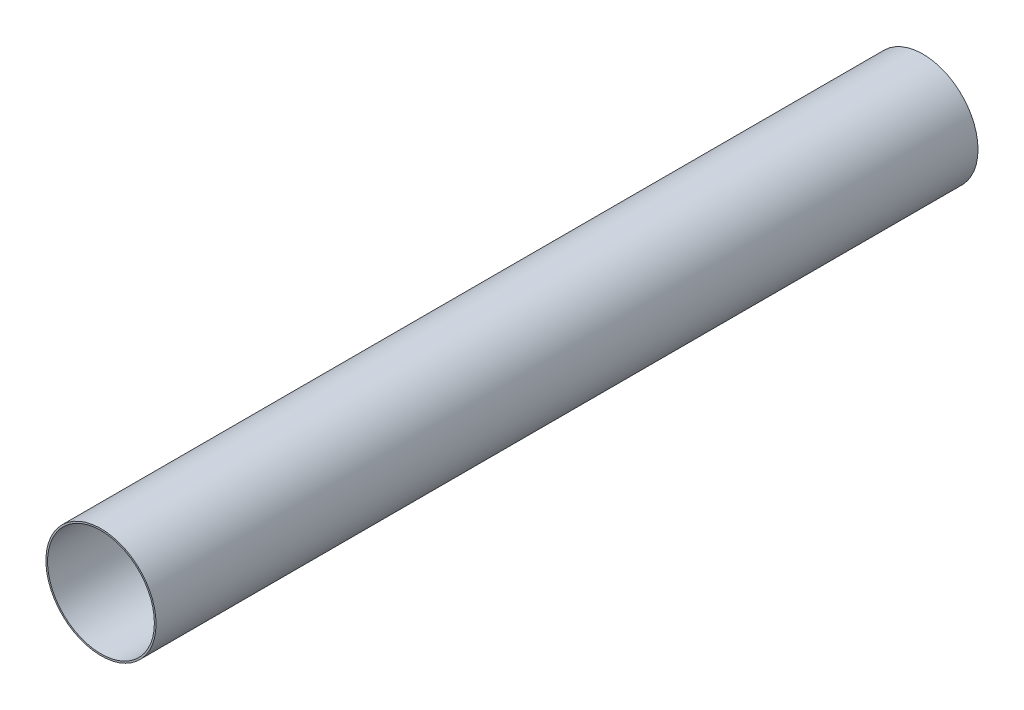
ISO-10303-21;
HEADER;
FILE_DESCRIPTION(('STEP AP214'),'2;1');
FILE_NAME('part.step','',(''),(''),'','','');
FILE_SCHEMA(('AUTOMOTIVE_DESIGN { 1 0 10303 214 1 1 1 1 }'));
ENDSEC;
DATA;
#1=APPLICATION_CONTEXT('core data for automotive mechanical design processes');
#2=APPLICATION_PROTOCOL_DEFINITION('international standard','automotive_design',2000,#1);
#3=PRODUCT_CONTEXT('',#1,'mechanical');
#4=PRODUCT('Part','Part','',(#3));
#5=PRODUCT_RELATED_PRODUCT_CATEGORY('part','',(#4));
#6=PRODUCT_DEFINITION_FORMATION('','',#4);
#7=PRODUCT_DEFINITION_CONTEXT('part definition',#1,'design');
#8=PRODUCT_DEFINITION('design','',#6,#7);
#9=PRODUCT_DEFINITION_SHAPE('','',#8);
#10=(LENGTH_UNIT() NAMED_UNIT(*) SI_UNIT(.MILLI.,.METRE.));
#11=(NAMED_UNIT(*) PLANE_ANGLE_UNIT() SI_UNIT($,.RADIAN.));
#12=(NAMED_UNIT(*) SI_UNIT($,.STERADIAN.) SOLID_ANGLE_UNIT());
#13=UNCERTAINTY_MEASURE_WITH_UNIT(LENGTH_MEASURE(1.E-05),#10,'distance_accuracy_value','');
#14=(GEOMETRIC_REPRESENTATION_CONTEXT(3) GLOBAL_UNCERTAINTY_ASSIGNED_CONTEXT((#13)) GLOBAL_UNIT_ASSIGNED_CONTEXT((#10,
#11,#12)) REPRESENTATION_CONTEXT('',''));
#15=CARTESIAN_POINT('',(0.,0.,0.));
#16=DIRECTION('',(0.,0.,1.));
#17=DIRECTION('',(1.,0.,0.));
#18=AXIS2_PLACEMENT_3D('',#15,#16,#17);
#19=CARTESIAN_POINT('',(0.,0.,762.));
#20=DIRECTION('',(0.,0.,1.));
#21=DIRECTION('',(1.,0.,0.));
#22=AXIS2_PLACEMENT_3D('',#19,#20,#21);
#23=PLANE('',#22);
#24=CARTESIAN_POINT('',(0.,0.,762.));
#25=DIRECTION('',(0.,0.,1.));
#26=DIRECTION('',(1.,0.,0.));
#27=AXIS2_PLACEMENT_3D('',#24,#25,#26);
#28=CIRCLE('',#27,51.054);
#29=CARTESIAN_POINT('',(51.054,0.,762.));
#30=VERTEX_POINT('',#29);
#31=EDGE_CURVE('E10',#30,#30,#28,.T.);
#32=ORIENTED_EDGE('',*,*,#31,.T.);
#33=EDGE_LOOP('',(#32));
#34=FACE_BOUND('',#33,.T.);
#35=CARTESIAN_POINT('',(0.,0.,762.));
#36=DIRECTION('',(0.,0.,1.));
#37=DIRECTION('',(1.,0.,0.));
#38=AXIS2_PLACEMENT_3D('',#35,#36,#37);
#39=CIRCLE('',#38,49.53);
#40=CARTESIAN_POINT('',(49.53,0.,762.));
#41=VERTEX_POINT('',#40);
#42=EDGE_CURVE('E57',#41,#41,#39,.T.);
#43=ORIENTED_EDGE('',*,*,#42,.F.);
#44=EDGE_LOOP('',(#43));
#45=FACE_BOUND('',#44,.T.);
#46=ADVANCED_FACE('F43',(#34,#45),#23,.T.);
#47=CARTESIAN_POINT('',(0.,0.,0.));
#48=DIRECTION('',(0.,0.,1.));
#49=DIRECTION('',(1.,0.,0.));
#50=AXIS2_PLACEMENT_3D('',#47,#48,#49);
#51=PLANE('',#50);
#52=CARTESIAN_POINT('',(0.,0.,0.));
#53=DIRECTION('',(0.,0.,1.));
#54=DIRECTION('',(1.,0.,0.));
#55=AXIS2_PLACEMENT_3D('',#52,#53,#54);
#56=CIRCLE('',#55,51.054);
#57=CARTESIAN_POINT('',(51.054,0.,0.));
#58=VERTEX_POINT('',#57);
#59=EDGE_CURVE('E50',#58,#58,#56,.T.);
#60=ORIENTED_EDGE('',*,*,#59,.F.);
#61=EDGE_LOOP('',(#60));
#62=FACE_BOUND('',#61,.T.);
#63=CARTESIAN_POINT('',(0.,0.,0.));
#64=DIRECTION('',(0.,0.,1.));
#65=DIRECTION('',(1.,0.,0.));
#66=AXIS2_PLACEMENT_3D('',#63,#64,#65);
#67=CIRCLE('',#66,49.53);
#68=CARTESIAN_POINT('',(49.53,0.,0.));
#69=VERTEX_POINT('',#68);
#70=EDGE_CURVE('E59',#69,#69,#67,.T.);
#71=ORIENTED_EDGE('',*,*,#70,.T.);
#72=EDGE_LOOP('',(#71));
#73=FACE_BOUND('',#72,.T.);
#74=ADVANCED_FACE('F69',(#62,#73),#51,.F.);
#75=CARTESIAN_POINT('',(0.,0.,762.));
#76=DIRECTION('',(0.,0.,-1.));
#77=DIRECTION('',(-1.,0.,0.));
#78=AXIS2_PLACEMENT_3D('',#75,#76,#77);
#79=CYLINDRICAL_SURFACE('',#78,51.054);
#80=ORIENTED_EDGE('',*,*,#31,.F.);
#81=EDGE_LOOP('',(#80));
#82=FACE_BOUND('',#81,.T.);
#83=ORIENTED_EDGE('',*,*,#59,.T.);
#84=EDGE_LOOP('',(#83));
#85=FACE_BOUND('',#84,.T.);
#86=ADVANCED_FACE('F44',(#82,#85),#79,.T.);
#87=CARTESIAN_POINT('',(0.,0.,762.));
#88=DIRECTION('',(0.,0.,-1.));
#89=DIRECTION('',(-1.,0.,0.));
#90=AXIS2_PLACEMENT_3D('',#87,#88,#89);
#91=CYLINDRICAL_SURFACE('',#90,49.53);
#92=ORIENTED_EDGE('',*,*,#42,.T.);
#93=EDGE_LOOP('',(#92));
#94=FACE_BOUND('',#93,.T.);
#95=ORIENTED_EDGE('',*,*,#70,.F.);
#96=EDGE_LOOP('',(#95));
#97=FACE_BOUND('',#96,.T.);
#98=ADVANCED_FACE('F66',(#94,#97),#91,.F.);
#99=CLOSED_SHELL('',(#46,#74,#86,#98));
#100=MANIFOLD_SOLID_BREP('B2',#99);
#101=ADVANCED_BREP_SHAPE_REPRESENTATION('',(#18,#100),#14);
#102=SHAPE_DEFINITION_REPRESENTATION(#9,#101);
ENDSEC;
END-ISO-10303-21;
